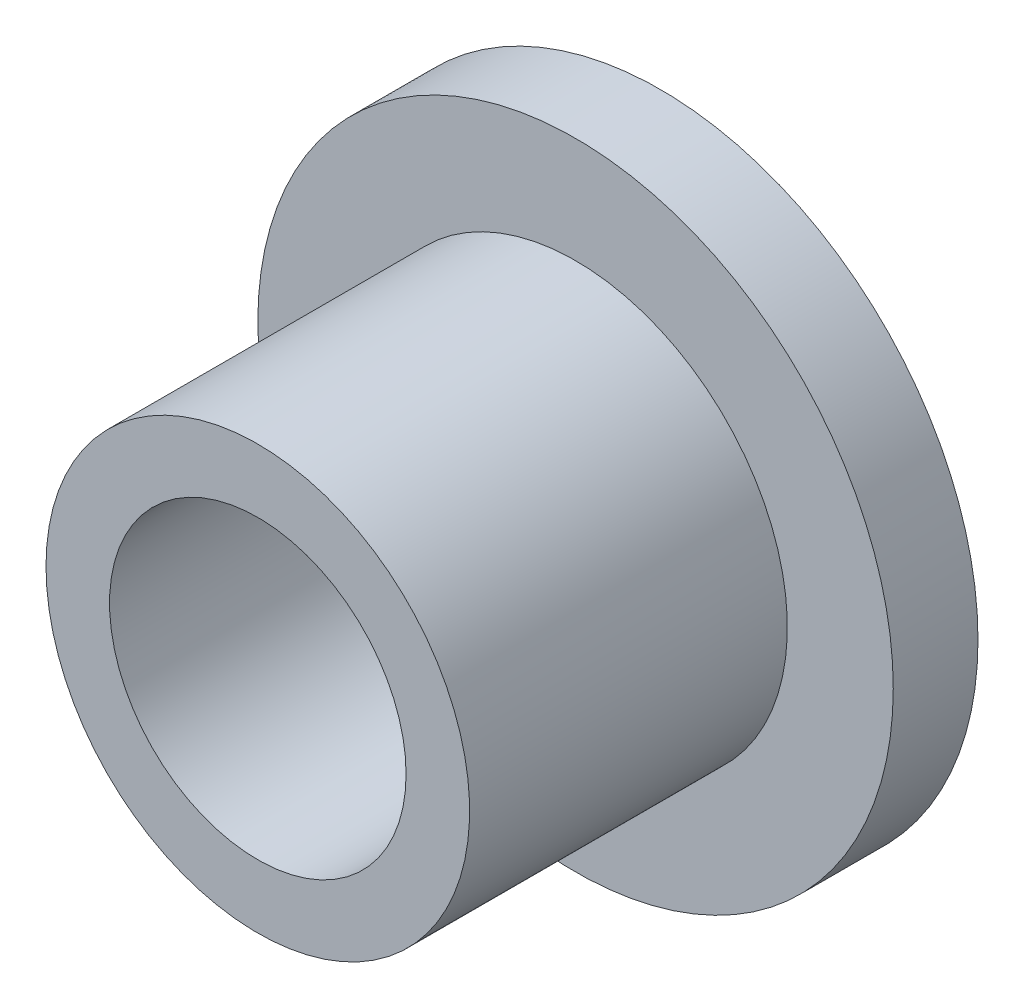
ISO-10303-21;
HEADER;
FILE_DESCRIPTION(('STEP AP214'),'2;1');
FILE_NAME('part.step','',(''),(''),'','','');
FILE_SCHEMA(('AUTOMOTIVE_DESIGN { 1 0 10303 214 1 1 1 1 }'));
ENDSEC;
DATA;
#1=APPLICATION_CONTEXT('core data for automotive mechanical design processes');
#2=APPLICATION_PROTOCOL_DEFINITION('international standard','automotive_design',2000,#1);
#3=PRODUCT_CONTEXT('',#1,'mechanical');
#4=PRODUCT('Part','Part','',(#3));
#5=PRODUCT_RELATED_PRODUCT_CATEGORY('part','',(#4));
#6=PRODUCT_DEFINITION_FORMATION('','',#4);
#7=PRODUCT_DEFINITION_CONTEXT('part definition',#1,'design');
#8=PRODUCT_DEFINITION('design','',#6,#7);
#9=PRODUCT_DEFINITION_SHAPE('','',#8);
#10=(LENGTH_UNIT() NAMED_UNIT(*) SI_UNIT(.MILLI.,.METRE.));
#11=(NAMED_UNIT(*) PLANE_ANGLE_UNIT() SI_UNIT($,.RADIAN.));
#12=(NAMED_UNIT(*) SI_UNIT($,.STERADIAN.) SOLID_ANGLE_UNIT());
#13=UNCERTAINTY_MEASURE_WITH_UNIT(LENGTH_MEASURE(1.E-05),#10,'distance_accuracy_value','');
#14=(GEOMETRIC_REPRESENTATION_CONTEXT(3) GLOBAL_UNCERTAINTY_ASSIGNED_CONTEXT((#13)) GLOBAL_UNIT_ASSIGNED_CONTEXT((#10,
#11,#12)) REPRESENTATION_CONTEXT('',''));
#15=CARTESIAN_POINT('',(0.,0.,0.));
#16=DIRECTION('',(0.,0.,1.));
#17=DIRECTION('',(1.,0.,0.));
#18=AXIS2_PLACEMENT_3D('',#15,#16,#17);
#19=CARTESIAN_POINT('',(0.,0.,-5.08));
#20=DIRECTION('',(0.,0.,1.));
#21=DIRECTION('',(1.,0.,0.));
#22=AXIS2_PLACEMENT_3D('',#19,#20,#21);
#23=CYLINDRICAL_SURFACE('',#22,19.05);
#24=CARTESIAN_POINT('',(0.,0.,-5.08));
#25=DIRECTION('',(0.,0.,1.));
#26=DIRECTION('',(1.,0.,0.));
#27=AXIS2_PLACEMENT_3D('',#24,#25,#26);
#28=CIRCLE('',#27,19.05);
#29=CARTESIAN_POINT('',(19.05,0.,-5.08));
#30=VERTEX_POINT('',#29);
#31=EDGE_CURVE('E45',#30,#30,#28,.T.);
#32=ORIENTED_EDGE('',*,*,#31,.T.);
#33=EDGE_LOOP('',(#32));
#34=FACE_BOUND('',#33,.T.);
#35=CARTESIAN_POINT('',(0.,0.,0.));
#36=DIRECTION('',(0.,0.,1.));
#37=DIRECTION('',(1.,0.,0.));
#38=AXIS2_PLACEMENT_3D('',#35,#36,#37);
#39=CIRCLE('',#38,19.05);
#40=CARTESIAN_POINT('',(19.05,0.,0.));
#41=VERTEX_POINT('',#40);
#42=EDGE_CURVE('E41',#41,#41,#39,.T.);
#43=ORIENTED_EDGE('',*,*,#42,.F.);
#44=EDGE_LOOP('',(#43));
#45=FACE_BOUND('',#44,.T.);
#46=ADVANCED_FACE('F38',(#34,#45),#23,.T.);
#47=CARTESIAN_POINT('',(0.,0.,-5.08));
#48=DIRECTION('',(0.,0.,1.));
#49=DIRECTION('',(1.,0.,0.));
#50=AXIS2_PLACEMENT_3D('',#47,#48,#49);
#51=PLANE('',#50);
#52=CARTESIAN_POINT('',(0.,0.,-5.08));
#53=DIRECTION('',(0.,0.,1.));
#54=DIRECTION('',(1.,0.,0.));
#55=AXIS2_PLACEMENT_3D('',#52,#53,#54);
#56=CIRCLE('',#55,8.89);
#57=CARTESIAN_POINT('',(8.89,0.,-5.08));
#58=VERTEX_POINT('',#57);
#59=EDGE_CURVE('E54',#58,#58,#56,.F.);
#60=ORIENTED_EDGE('',*,*,#59,.F.);
#61=EDGE_LOOP('',(#60));
#62=FACE_BOUND('',#61,.T.);
#63=ORIENTED_EDGE('',*,*,#31,.F.);
#64=EDGE_LOOP('',(#63));
#65=FACE_BOUND('',#64,.T.);
#66=ADVANCED_FACE('F77',(#62,#65),#51,.F.);
#67=CARTESIAN_POINT('',(0.,0.,0.));
#68=DIRECTION('',(0.,0.,1.));
#69=DIRECTION('',(1.,0.,0.));
#70=AXIS2_PLACEMENT_3D('',#67,#68,#69);
#71=PLANE('',#70);
#72=CARTESIAN_POINT('',(0.,0.,0.));
#73=DIRECTION('',(0.,0.,1.));
#74=DIRECTION('',(1.,0.,0.));
#75=AXIS2_PLACEMENT_3D('',#72,#73,#74);
#76=CIRCLE('',#75,12.7);
#77=CARTESIAN_POINT('',(-12.7,0.,0.));
#78=VERTEX_POINT('',#77);
#79=EDGE_CURVE('E10',#78,#78,#76,.T.);
#80=ORIENTED_EDGE('',*,*,#79,.F.);
#81=EDGE_LOOP('',(#80));
#82=FACE_BOUND('',#81,.T.);
#83=ORIENTED_EDGE('',*,*,#42,.T.);
#84=EDGE_LOOP('',(#83));
#85=FACE_BOUND('',#84,.T.);
#86=ADVANCED_FACE('F72',(#82,#85),#71,.T.);
#87=CARTESIAN_POINT('',(0.,0.,19.05));
#88=DIRECTION('',(0.,0.,-1.));
#89=DIRECTION('',(-1.,0.,0.));
#90=AXIS2_PLACEMENT_3D('',#87,#88,#89);
#91=CYLINDRICAL_SURFACE('',#90,12.7);
#92=CARTESIAN_POINT('',(0.,0.,19.05));
#93=DIRECTION('',(0.,0.,1.));
#94=DIRECTION('',(1.,0.,0.));
#95=AXIS2_PLACEMENT_3D('',#92,#93,#94);
#96=CIRCLE('',#95,12.7);
#97=CARTESIAN_POINT('',(-12.7,0.,19.05));
#98=VERTEX_POINT('',#97);
#99=EDGE_CURVE('E51',#98,#98,#96,.T.);
#100=CARTESIAN_POINT('',(-12.7,0.,19.05));
#101=CARTESIAN_POINT('',(-12.7,0.,18.8515625));
#102=CARTESIAN_POINT('',(-12.7,0.,18.653125));
#103=CARTESIAN_POINT('',(-12.7,0.,18.25625));
#104=CARTESIAN_POINT('',(-12.7,0.,18.0578125));
#105=CARTESIAN_POINT('',(-12.7,0.,17.6609375));
#106=CARTESIAN_POINT('',(-12.7,0.,17.4625));
#107=CARTESIAN_POINT('',(-12.7,0.,17.065625));
#108=CARTESIAN_POINT('',(-12.7,0.,16.8671875));
#109=CARTESIAN_POINT('',(-12.7,0.,16.4703125));
#110=CARTESIAN_POINT('',(-12.7,0.,16.271875));
#111=CARTESIAN_POINT('',(-12.7,0.,15.875));
#112=CARTESIAN_POINT('',(-12.7,0.,15.6765625));
#113=CARTESIAN_POINT('',(-12.7,0.,15.2796875));
#114=CARTESIAN_POINT('',(-12.7,0.,15.08125));
#115=CARTESIAN_POINT('',(-12.7,0.,14.684375));
#116=CARTESIAN_POINT('',(-12.7,0.,14.4859375));
#117=CARTESIAN_POINT('',(-12.7,0.,14.0890625));
#118=CARTESIAN_POINT('',(-12.7,0.,13.890625));
#119=CARTESIAN_POINT('',(-12.7,0.,13.49375));
#120=CARTESIAN_POINT('',(-12.7,0.,13.2953125));
#121=CARTESIAN_POINT('',(-12.7,0.,12.8984375));
#122=CARTESIAN_POINT('',(-12.7,0.,12.7));
#123=CARTESIAN_POINT('',(-12.7,0.,12.303125));
#124=CARTESIAN_POINT('',(-12.7,0.,12.1046875));
#125=CARTESIAN_POINT('',(-12.7,0.,11.7078125));
#126=CARTESIAN_POINT('',(-12.7,0.,11.509375));
#127=CARTESIAN_POINT('',(-12.7,0.,11.1125));
#128=CARTESIAN_POINT('',(-12.7,0.,10.9140625));
#129=CARTESIAN_POINT('',(-12.7,0.,10.5171875));
#130=CARTESIAN_POINT('',(-12.7,0.,10.31875));
#131=CARTESIAN_POINT('',(-12.7,0.,9.921875));
#132=CARTESIAN_POINT('',(-12.7,0.,9.7234375));
#133=CARTESIAN_POINT('',(-12.7,0.,9.3265625));
#134=CARTESIAN_POINT('',(-12.7,0.,9.128125));
#135=CARTESIAN_POINT('',(-12.7,0.,8.73125));
#136=CARTESIAN_POINT('',(-12.7,0.,8.5328125));
#137=CARTESIAN_POINT('',(-12.7,0.,8.1359375));
#138=CARTESIAN_POINT('',(-12.7,0.,7.9375));
#139=CARTESIAN_POINT('',(-12.7,0.,7.540625));
#140=CARTESIAN_POINT('',(-12.7,0.,7.3421875));
#141=CARTESIAN_POINT('',(-12.7,0.,6.9453125));
#142=CARTESIAN_POINT('',(-12.7,0.,6.746875));
#143=CARTESIAN_POINT('',(-12.7,0.,6.35));
#144=CARTESIAN_POINT('',(-12.7,0.,6.1515625));
#145=CARTESIAN_POINT('',(-12.7,0.,5.7546875));
#146=CARTESIAN_POINT('',(-12.7,0.,5.55625));
#147=CARTESIAN_POINT('',(-12.7,0.,5.159375));
#148=CARTESIAN_POINT('',(-12.7,0.,4.9609375));
#149=CARTESIAN_POINT('',(-12.7,0.,4.5640625));
#150=CARTESIAN_POINT('',(-12.7,0.,4.365625));
#151=CARTESIAN_POINT('',(-12.7,0.,3.96875));
#152=CARTESIAN_POINT('',(-12.7,0.,3.7703125));
#153=CARTESIAN_POINT('',(-12.7,0.,3.3734375));
#154=CARTESIAN_POINT('',(-12.7,0.,3.175));
#155=CARTESIAN_POINT('',(-12.7,0.,2.778125));
#156=CARTESIAN_POINT('',(-12.7,0.,2.5796875));
#157=CARTESIAN_POINT('',(-12.7,0.,2.1828125));
#158=CARTESIAN_POINT('',(-12.7,0.,1.984375));
#159=CARTESIAN_POINT('',(-12.7,0.,1.5875));
#160=CARTESIAN_POINT('',(-12.7,0.,1.3890625));
#161=CARTESIAN_POINT('',(-12.7,0.,0.992187500000001));
#162=CARTESIAN_POINT('',(-12.7,0.,0.793750000000001));
#163=CARTESIAN_POINT('',(-12.7,0.,0.396875));
#164=CARTESIAN_POINT('',(-12.7,0.,0.1984375));
#165=CARTESIAN_POINT('',(-12.7,0.,0.));
#166=B_SPLINE_CURVE_WITH_KNOTS('',3,(#100,#101,#102,#103,#104,#105,#106,#107,#108,#109,#110,
#111,#112,#113,#114,#115,#116,#117,#118,#119,#120,#121,#122,#123,#124,#125,#126,#127,#128,#129,
#130,#131,#132,#133,#134,#135,#136,#137,#138,#139,#140,#141,#142,#143,#144,#145,#146,#147,#148,
#149,#150,#151,#152,#153,#154,#155,#156,#157,#158,#159,#160,#161,#162,#163,#164,#165),
.UNSPECIFIED.,.F.,.F.,(4,2,2,2,2,2,2,2,2,2,2,2,2,2,2,2,2,2,2,2,2,2,2,2,2,2,2,2,2,2,2,2,4),(0.,
0.595312499999997,1.190625,1.7859375,2.38125,2.9765625,3.571875,4.1671875,4.7625,5.3578125,
5.953125,6.5484375,7.14375,7.7390625,8.334375,8.9296875,9.525,10.1203125,10.715625,11.3109375,
11.90625,12.5015625,13.096875,13.6921875,14.2875,14.8828125,15.478125,16.0734375,16.66875,
17.2640625,17.859375,18.4546875,19.05),.UNSPECIFIED.);
#167=EDGE_CURVE('BSEAM67',#98,#78,#166,.T.);
#168=ORIENTED_EDGE('',*,*,#99,.F.);
#169=ORIENTED_EDGE('',*,*,#79,.T.);
#170=ORIENTED_EDGE('',*,*,#167,.T.);
#171=ORIENTED_EDGE('',*,*,#167,.F.);
#172=EDGE_LOOP('',(#168,#170,#169,#171));
#173=FACE_BOUND('',#172,.T.);
#174=ADVANCED_FACE('F67',(#173),#91,.T.);
#175=CARTESIAN_POINT('',(0.,0.,19.05));
#176=DIRECTION('',(0.,0.,1.));
#177=DIRECTION('',(1.,0.,0.));
#178=AXIS2_PLACEMENT_3D('',#175,#176,#177);
#179=PLANE('',#178);
#180=CARTESIAN_POINT('',(0.,0.,19.05));
#181=DIRECTION('',(0.,0.,1.));
#182=DIRECTION('',(1.,0.,0.));
#183=AXIS2_PLACEMENT_3D('',#180,#181,#182);
#184=CIRCLE('',#183,8.89);
#185=CARTESIAN_POINT('',(8.89,0.,19.05));
#186=VERTEX_POINT('',#185);
#187=EDGE_CURVE('E57',#186,#186,#184,.T.);
#188=ORIENTED_EDGE('',*,*,#187,.F.);
#189=EDGE_LOOP('',(#188));
#190=FACE_BOUND('',#189,.T.);
#191=ORIENTED_EDGE('',*,*,#99,.T.);
#192=EDGE_LOOP('',(#191));
#193=FACE_BOUND('',#192,.T.);
#194=ADVANCED_FACE('F64',(#190,#193),#179,.T.);
#195=CARTESIAN_POINT('',(0.,0.,-5.081));
#196=DIRECTION('',(0.,0.,1.));
#197=DIRECTION('',(1.,0.,0.));
#198=AXIS2_PLACEMENT_3D('',#195,#196,#197);
#199=CYLINDRICAL_SURFACE('',#198,8.89);
#200=ORIENTED_EDGE('',*,*,#187,.T.);
#201=EDGE_LOOP('',(#200));
#202=FACE_BOUND('',#201,.T.);
#203=ORIENTED_EDGE('',*,*,#59,.T.);
#204=EDGE_LOOP('',(#203));
#205=FACE_BOUND('',#204,.T.);
#206=ADVANCED_FACE('F61',(#202,#205),#199,.F.);
#207=CLOSED_SHELL('',(#46,#66,#86,#174,#194,#206));
#208=MANIFOLD_SOLID_BREP('B2',#207);
#209=ADVANCED_BREP_SHAPE_REPRESENTATION('',(#18,#208),#14);
#210=SHAPE_DEFINITION_REPRESENTATION(#9,#209);
ENDSEC;
END-ISO-10303-21;
